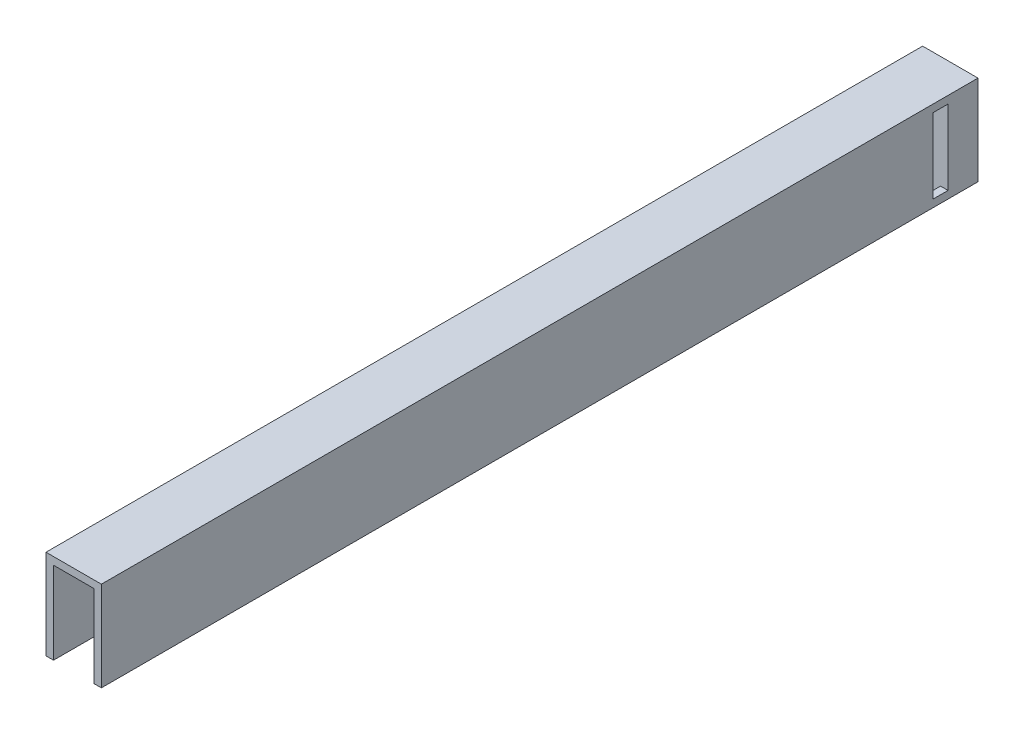
ISO-10303-21;
HEADER;
FILE_DESCRIPTION(('STEP AP214'),'2;1');
FILE_NAME('part.step','',(''),(''),'','','');
FILE_SCHEMA(('AUTOMOTIVE_DESIGN { 1 0 10303 214 1 1 1 1 }'));
ENDSEC;
DATA;
#1=APPLICATION_CONTEXT('core data for automotive mechanical design processes');
#2=APPLICATION_PROTOCOL_DEFINITION('international standard','automotive_design',2000,#1);
#3=PRODUCT_CONTEXT('',#1,'mechanical');
#4=PRODUCT('Part','Part','',(#3));
#5=PRODUCT_RELATED_PRODUCT_CATEGORY('part','',(#4));
#6=PRODUCT_DEFINITION_FORMATION('','',#4);
#7=PRODUCT_DEFINITION_CONTEXT('part definition',#1,'design');
#8=PRODUCT_DEFINITION('design','',#6,#7);
#9=PRODUCT_DEFINITION_SHAPE('','',#8);
#10=(LENGTH_UNIT() NAMED_UNIT(*) SI_UNIT(.MILLI.,.METRE.));
#11=(NAMED_UNIT(*) PLANE_ANGLE_UNIT() SI_UNIT($,.RADIAN.));
#12=(NAMED_UNIT(*) SI_UNIT($,.STERADIAN.) SOLID_ANGLE_UNIT());
#13=UNCERTAINTY_MEASURE_WITH_UNIT(LENGTH_MEASURE(1.E-05),#10,'distance_accuracy_value','');
#14=(GEOMETRIC_REPRESENTATION_CONTEXT(3) GLOBAL_UNCERTAINTY_ASSIGNED_CONTEXT((#13)) GLOBAL_UNIT_ASSIGNED_CONTEXT((#10,
#11,#12)) REPRESENTATION_CONTEXT('',''));
#15=CARTESIAN_POINT('',(0.,0.,0.));
#16=DIRECTION('',(0.,0.,1.));
#17=DIRECTION('',(1.,0.,0.));
#18=AXIS2_PLACEMENT_3D('',#15,#16,#17);
#19=CARTESIAN_POINT('',(-13.1469856686012,22.7753158980131,12.4635998388869));
#20=DIRECTION('',(-1.,0.,0.));
#21=DIRECTION('',(0.,0.,1.));
#22=AXIS2_PLACEMENT_3D('',#19,#20,#21);
#23=PLANE('',#22);
#24=DIRECTION('',(0.,0.,-1.));
#25=VECTOR('',#24,1.);
#26=CARTESIAN_POINT('',(-13.1469856686012,19.2220765281209,-147.432171806263));
#27=LINE('',#26,#25);
#28=CARTESIAN_POINT('',(-13.1469856686012,19.2220765281209,-143.878932436371));
#29=VERTEX_POINT('',#28);
#30=CARTESIAN_POINT('',(-13.1469856686012,19.2220765281209,-150.985411176155));
#31=VERTEX_POINT('',#30);
#32=EDGE_CURVE('E222',#29,#31,#27,.T.);
#33=ORIENTED_EDGE('',*,*,#32,.F.);
#34=DIRECTION('',(0.,-1.,0.));
#35=VECTOR('',#34,1.);
#36=CARTESIAN_POINT('',(-13.1469856686012,1.45587967865977,-143.878932436371));
#37=LINE('',#36,#35);
#38=CARTESIAN_POINT('',(-13.1469856686012,-16.3103171708013,-143.878932436371));
#39=VERTEX_POINT('',#38);
#40=EDGE_CURVE('E321',#29,#39,#37,.T.);
#41=ORIENTED_EDGE('',*,*,#40,.T.);
#42=DIRECTION('',(0.,0.,-1.));
#43=VECTOR('',#42,1.);
#44=CARTESIAN_POINT('',(-13.1469856686012,-16.3103171708013,-147.432171806263));
#45=LINE('',#44,#43);
#46=CARTESIAN_POINT('',(-13.1469856686012,-16.3103171708013,-150.985411176155));
#47=VERTEX_POINT('',#46);
#48=EDGE_CURVE('E224',#39,#47,#45,.T.);
#49=ORIENTED_EDGE('',*,*,#48,.T.);
#50=DIRECTION('',(0.,1.,0.));
#51=VECTOR('',#50,1.);
#52=CARTESIAN_POINT('',(-13.1469856686012,1.45587967865977,-150.985411176155));
#53=LINE('',#52,#51);
#54=EDGE_CURVE('E55',#47,#31,#53,.T.);
#55=ORIENTED_EDGE('',*,*,#54,.T.);
#56=EDGE_LOOP('',(#33,#41,#49,#55));
#57=FACE_BOUND('',#56,.T.);
#58=DIRECTION('',(0.,1.,0.));
#59=VECTOR('',#58,1.);
#60=CARTESIAN_POINT('',(-13.1469856686012,1.45587967865978,250.959868937549));
#61=LINE('',#60,#59);
#62=CARTESIAN_POINT('',(-13.1469856686012,-19.8635565406935,250.959868937549));
#63=VERTEX_POINT('',#62);
#64=CARTESIAN_POINT('',(-13.1469856686012,22.7753158980131,250.959868937549));
#65=VERTEX_POINT('',#64);
#66=EDGE_CURVE('E302',#63,#65,#61,.T.);
#67=ORIENTED_EDGE('',*,*,#66,.T.);
#68=DIRECTION('',(0.,0.,1.));
#69=VECTOR('',#68,1.);
#70=CARTESIAN_POINT('',(-13.1469856686012,22.7753158980131,42.8807501409123));
#71=LINE('',#70,#69);
#72=CARTESIAN_POINT('',(-13.1469856686012,22.7753158980131,-165.198368655724));
#73=VERTEX_POINT('',#72);
#74=EDGE_CURVE('E123',#73,#65,#71,.T.);
#75=ORIENTED_EDGE('',*,*,#74,.F.);
#76=DIRECTION('',(0.,1.,0.));
#77=VECTOR('',#76,1.);
#78=CARTESIAN_POINT('',(-13.1469856686012,1.45587967865978,-165.198368655724));
#79=LINE('',#78,#77);
#80=CARTESIAN_POINT('',(-13.1469856686012,-19.8635565406935,-165.198368655724));
#81=VERTEX_POINT('',#80);
#82=EDGE_CURVE('E336',#81,#73,#79,.T.);
#83=ORIENTED_EDGE('',*,*,#82,.F.);
#84=DIRECTION('',(0.,0.,1.));
#85=VECTOR('',#84,1.);
#86=CARTESIAN_POINT('',(-13.1469856686012,-19.8635565406935,42.8807501409123));
#87=LINE('',#86,#85);
#88=EDGE_CURVE('E107',#81,#63,#87,.T.);
#89=ORIENTED_EDGE('',*,*,#88,.T.);
#90=EDGE_LOOP('',(#67,#75,#83,#89));
#91=FACE_BOUND('',#90,.T.);
#92=ADVANCED_FACE('F44',(#57,#91),#23,.T.);
#93=CARTESIAN_POINT('',(13.1469856686012,-19.8635565406935,12.4635998388869));
#94=DIRECTION('',(1.,0.,0.));
#95=DIRECTION('',(0.,1.,0.));
#96=AXIS2_PLACEMENT_3D('',#93,#94,#95);
#97=PLANE('',#96);
#98=DIRECTION('',(0.,1.,0.));
#99=VECTOR('',#98,1.);
#100=CARTESIAN_POINT('',(13.1469856686012,1.45587967865977,-150.985411176155));
#101=LINE('',#100,#99);
#102=CARTESIAN_POINT('',(13.1469856686012,-16.3103171708013,-150.985411176155));
#103=VERTEX_POINT('',#102);
#104=CARTESIAN_POINT('',(13.1469856686012,19.2220765281209,-150.985411176155));
#105=VERTEX_POINT('',#104);
#106=EDGE_CURVE('E11',#103,#105,#101,.T.);
#107=ORIENTED_EDGE('',*,*,#106,.F.);
#108=DIRECTION('',(0.,0.,-1.));
#109=VECTOR('',#108,1.);
#110=CARTESIAN_POINT('',(13.1469856686012,-16.3103171708013,-147.432171806263));
#111=LINE('',#110,#109);
#112=CARTESIAN_POINT('',(13.1469856686012,-16.3103171708013,-143.878932436371));
#113=VERTEX_POINT('',#112);
#114=EDGE_CURVE('E291',#113,#103,#111,.T.);
#115=ORIENTED_EDGE('',*,*,#114,.F.);
#116=DIRECTION('',(0.,-1.,0.));
#117=VECTOR('',#116,1.);
#118=CARTESIAN_POINT('',(13.1469856686012,1.45587967865978,-143.878932436371));
#119=LINE('',#118,#117);
#120=CARTESIAN_POINT('',(13.1469856686012,19.2220765281209,-143.878932436371));
#121=VERTEX_POINT('',#120);
#122=EDGE_CURVE('E290',#121,#113,#119,.T.);
#123=ORIENTED_EDGE('',*,*,#122,.F.);
#124=DIRECTION('',(0.,0.,1.));
#125=VECTOR('',#124,1.);
#126=CARTESIAN_POINT('',(13.1469856686012,19.2220765281209,-147.432171806263));
#127=LINE('',#126,#125);
#128=EDGE_CURVE('E246',#105,#121,#127,.T.);
#129=ORIENTED_EDGE('',*,*,#128,.F.);
#130=EDGE_LOOP('',(#107,#115,#123,#129));
#131=FACE_BOUND('',#130,.T.);
#132=DIRECTION('',(0.,-1.,0.));
#133=VECTOR('',#132,1.);
#134=CARTESIAN_POINT('',(13.1469856686012,1.45587967865978,250.959868937549));
#135=LINE('',#134,#133);
#136=CARTESIAN_POINT('',(13.1469856686012,22.7753158980131,250.959868937549));
#137=VERTEX_POINT('',#136);
#138=CARTESIAN_POINT('',(13.1469856686012,-19.8635565406935,250.959868937549));
#139=VERTEX_POINT('',#138);
#140=EDGE_CURVE('E303',#137,#139,#135,.T.);
#141=ORIENTED_EDGE('',*,*,#140,.T.);
#142=DIRECTION('',(0.,0.,1.));
#143=VECTOR('',#142,1.);
#144=CARTESIAN_POINT('',(13.1469856686012,-19.8635565406935,42.8807501409123));
#145=LINE('',#144,#143);
#146=CARTESIAN_POINT('',(13.1469856686012,-19.8635565406935,-165.198368655724));
#147=VERTEX_POINT('',#146);
#148=EDGE_CURVE('E267',#147,#139,#145,.T.);
#149=ORIENTED_EDGE('',*,*,#148,.F.);
#150=DIRECTION('',(0.,-1.,0.));
#151=VECTOR('',#150,1.);
#152=CARTESIAN_POINT('',(13.1469856686012,1.45587967865978,-165.198368655724));
#153=LINE('',#152,#151);
#154=CARTESIAN_POINT('',(13.1469856686012,22.7753158980131,-165.198368655724));
#155=VERTEX_POINT('',#154);
#156=EDGE_CURVE('E281',#155,#147,#153,.T.);
#157=ORIENTED_EDGE('',*,*,#156,.F.);
#158=DIRECTION('',(0.,0.,1.));
#159=VECTOR('',#158,1.);
#160=CARTESIAN_POINT('',(13.1469856686012,22.7753158980131,42.8807501409123));
#161=LINE('',#160,#159);
#162=EDGE_CURVE('E193',#155,#137,#161,.T.);
#163=ORIENTED_EDGE('',*,*,#162,.T.);
#164=EDGE_LOOP('',(#141,#149,#157,#163));
#165=FACE_BOUND('',#164,.T.);
#166=ADVANCED_FACE('F629',(#131,#165),#97,.T.);
#167=CARTESIAN_POINT('',(13.1469856686012,-16.3103171708013,-150.985411176155));
#168=DIRECTION('',(0.,0.,1.));
#169=DIRECTION('',(1.,0.,0.));
#170=AXIS2_PLACEMENT_3D('',#167,#168,#169);
#171=PLANE('',#170);
#172=DIRECTION('',(-1.,0.,0.));
#173=VECTOR('',#172,1.);
#174=CARTESIAN_POINT('',(0.,19.2220765281209,-150.985411176155));
#175=LINE('',#174,#173);
#176=EDGE_CURVE('E235',#105,#31,#175,.T.);
#177=ORIENTED_EDGE('',*,*,#176,.T.);
#178=ORIENTED_EDGE('',*,*,#54,.F.);
#179=DIRECTION('',(-1.,0.,0.));
#180=VECTOR('',#179,1.);
#181=CARTESIAN_POINT('',(-11.3703659836551,-16.3103171708013,-150.985411176155));
#182=LINE('',#181,#180);
#183=CARTESIAN_POINT('',(-9.59374629870899,-16.3103171708013,-150.985411176155));
#184=VERTEX_POINT('',#183);
#185=EDGE_CURVE('E277',#184,#47,#182,.T.);
#186=ORIENTED_EDGE('',*,*,#185,.F.);
#187=DIRECTION('',(0.,1.,0.));
#188=VECTOR('',#187,1.);
#189=CARTESIAN_POINT('',(-9.59374629870899,-18.0869368557474,-150.985411176155));
#190=LINE('',#189,#188);
#191=CARTESIAN_POINT('',(-9.59374629870899,-19.8635565406935,-150.985411176155));
#192=VERTEX_POINT('',#191);
#193=EDGE_CURVE('E276',#192,#184,#190,.T.);
#194=ORIENTED_EDGE('',*,*,#193,.F.);
#195=DIRECTION('',(-1.,0.,0.));
#196=VECTOR('',#195,1.);
#197=CARTESIAN_POINT('',(0.,-19.8635565406935,-150.985411176155));
#198=LINE('',#197,#196);
#199=CARTESIAN_POINT('',(9.59374629870899,-19.8635565406935,-150.985411176155));
#200=VERTEX_POINT('',#199);
#201=EDGE_CURVE('E68',#200,#192,#198,.T.);
#202=ORIENTED_EDGE('',*,*,#201,.F.);
#203=DIRECTION('',(0.,1.,0.));
#204=VECTOR('',#203,1.);
#205=CARTESIAN_POINT('',(9.59374629870899,-18.0869368557474,-150.985411176155));
#206=LINE('',#205,#204);
#207=CARTESIAN_POINT('',(9.59374629870899,-16.3103171708013,-150.985411176155));
#208=VERTEX_POINT('',#207);
#209=EDGE_CURVE('E259',#200,#208,#206,.T.);
#210=ORIENTED_EDGE('',*,*,#209,.T.);
#211=DIRECTION('',(-1.,0.,0.));
#212=VECTOR('',#211,1.);
#213=CARTESIAN_POINT('',(11.3703659836551,-16.3103171708013,-150.985411176155));
#214=LINE('',#213,#212);
#215=EDGE_CURVE('E287',#103,#208,#214,.T.);
#216=ORIENTED_EDGE('',*,*,#215,.F.);
#217=ORIENTED_EDGE('',*,*,#106,.T.);
#218=EDGE_LOOP('',(#177,#178,#186,#194,#202,#210,#216,#217));
#219=FACE_BOUND('',#218,.T.);
#220=ADVANCED_FACE('F242',(#219),#171,.T.);
#221=CARTESIAN_POINT('',(-9.59374629870899,-19.8635565406935,12.4635998388869));
#222=DIRECTION('',(0.,1.,0.));
#223=DIRECTION('',(1.,0.,0.));
#224=AXIS2_PLACEMENT_3D('',#221,#222,#223);
#225=PLANE('',#224);
#226=DIRECTION('',(-1.,0.,0.));
#227=VECTOR('',#226,1.);
#228=CARTESIAN_POINT('',(-11.3703659836551,-19.8635565406935,250.959868937549));
#229=LINE('',#228,#227);
#230=CARTESIAN_POINT('',(-9.59374629870899,-19.8635565406935,250.959868937549));
#231=VERTEX_POINT('',#230);
#232=EDGE_CURVE('E347',#231,#63,#229,.T.);
#233=ORIENTED_EDGE('',*,*,#232,.T.);
#234=ORIENTED_EDGE('',*,*,#88,.F.);
#235=DIRECTION('',(-1.,0.,0.));
#236=VECTOR('',#235,1.);
#237=CARTESIAN_POINT('',(-11.3703659836551,-19.8635565406935,-165.198368655724));
#238=LINE('',#237,#236);
#239=CARTESIAN_POINT('',(-9.59374629870899,-19.8635565406935,-165.198368655724));
#240=VERTEX_POINT('',#239);
#241=EDGE_CURVE('E340',#240,#81,#238,.T.);
#242=ORIENTED_EDGE('',*,*,#241,.F.);
#243=DIRECTION('',(0.,0.,1.));
#244=VECTOR('',#243,1.);
#245=CARTESIAN_POINT('',(-9.59374629870899,-19.8635565406935,-159.157861726907));
#246=LINE('',#245,#244);
#247=CARTESIAN_POINT('',(-9.59374629870899,-19.8635565406935,-153.11735479809));
#248=VERTEX_POINT('',#247);
#249=EDGE_CURVE('E266',#240,#248,#246,.T.);
#250=ORIENTED_EDGE('',*,*,#249,.T.);
#251=DIRECTION('',(-1.,0.,0.));
#252=VECTOR('',#251,1.);
#253=CARTESIAN_POINT('',(0.,-19.8635565406935,-153.11735479809));
#254=LINE('',#253,#252);
#255=CARTESIAN_POINT('',(9.59374629870899,-19.8635565406935,-153.11735479809));
#256=VERTEX_POINT('',#255);
#257=EDGE_CURVE('E348',#256,#248,#254,.T.);
#258=ORIENTED_EDGE('',*,*,#257,.F.);
#259=DIRECTION('',(0.,0.,1.));
#260=VECTOR('',#259,1.);
#261=CARTESIAN_POINT('',(9.59374629870899,-19.8635565406935,-159.157861726907));
#262=LINE('',#261,#260);
#263=CARTESIAN_POINT('',(9.59374629870899,-19.8635565406935,-165.198368655724));
#264=VERTEX_POINT('',#263);
#265=EDGE_CURVE('E292',#264,#256,#262,.T.);
#266=ORIENTED_EDGE('',*,*,#265,.F.);
#267=DIRECTION('',(-1.,0.,0.));
#268=VECTOR('',#267,1.);
#269=CARTESIAN_POINT('',(11.3703659836551,-19.8635565406935,-165.198368655724));
#270=LINE('',#269,#268);
#271=EDGE_CURVE('E284',#147,#264,#270,.T.);
#272=ORIENTED_EDGE('',*,*,#271,.F.);
#273=ORIENTED_EDGE('',*,*,#148,.T.);
#274=DIRECTION('',(-1.,0.,0.));
#275=VECTOR('',#274,1.);
#276=CARTESIAN_POINT('',(11.3703659836551,-19.8635565406935,250.959868937549));
#277=LINE('',#276,#275);
#278=CARTESIAN_POINT('',(9.59374629870899,-19.8635565406935,250.959868937549));
#279=VERTEX_POINT('',#278);
#280=EDGE_CURVE('E48',#139,#279,#277,.T.);
#281=ORIENTED_EDGE('',*,*,#280,.T.);
#282=DIRECTION('',(0.,0.,1.));
#283=VECTOR('',#282,1.);
#284=CARTESIAN_POINT('',(9.59374629870899,-19.8635565406935,49.9872288806967));
#285=LINE('',#284,#283);
#286=EDGE_CURVE('E356',#200,#279,#285,.T.);
#287=ORIENTED_EDGE('',*,*,#286,.F.);
#288=ORIENTED_EDGE('',*,*,#201,.T.);
#289=DIRECTION('',(0.,0.,1.));
#290=VECTOR('',#289,1.);
#291=CARTESIAN_POINT('',(-9.59374629870899,-19.8635565406935,49.9872288806967));
#292=LINE('',#291,#290);
#293=EDGE_CURVE('E280',#192,#231,#292,.T.);
#294=ORIENTED_EDGE('',*,*,#293,.T.);
#295=EDGE_LOOP('',(#233,#234,#242,#250,#258,#266,#272,#273,#281,#287,#288,#294));
#296=FACE_BOUND('',#295,.T.);
#297=ADVANCED_FACE('F422',(#296),#225,.F.);
#298=CARTESIAN_POINT('',(-9.59374629870899,19.2220765281209,12.4635998388869));
#299=DIRECTION('',(-1.,0.,0.));
#300=DIRECTION('',(0.,0.,1.));
#301=AXIS2_PLACEMENT_3D('',#298,#299,#300);
#302=PLANE('',#301);
#303=ORIENTED_EDGE('',*,*,#193,.T.);
#304=DIRECTION('',(0.,0.,-1.));
#305=VECTOR('',#304,1.);
#306=CARTESIAN_POINT('',(-9.59374629870899,-16.3103171708013,-147.432171806263));
#307=LINE('',#306,#305);
#308=CARTESIAN_POINT('',(-9.59374629870899,-16.3103171708013,-143.878932436371));
#309=VERTEX_POINT('',#308);
#310=EDGE_CURVE('E298',#309,#184,#307,.T.);
#311=ORIENTED_EDGE('',*,*,#310,.F.);
#312=DIRECTION('',(0.,-1.,0.));
#313=VECTOR('',#312,1.);
#314=CARTESIAN_POINT('',(-9.59374629870899,1.45587967865977,-143.878932436371));
#315=LINE('',#314,#313);
#316=CARTESIAN_POINT('',(-9.59374629870899,19.2220765281209,-143.878932436371));
#317=VERTEX_POINT('',#316);
#318=EDGE_CURVE('E309',#317,#309,#315,.T.);
#319=ORIENTED_EDGE('',*,*,#318,.F.);
#320=DIRECTION('',(0.,0.,1.));
#321=VECTOR('',#320,1.);
#322=CARTESIAN_POINT('',(-9.59374629870899,19.2220765281209,53.540468250589));
#323=LINE('',#322,#321);
#324=CARTESIAN_POINT('',(-9.59374629870899,19.2220765281209,250.959868937549));
#325=VERTEX_POINT('',#324);
#326=EDGE_CURVE('E308',#317,#325,#323,.T.);
#327=ORIENTED_EDGE('',*,*,#326,.T.);
#328=DIRECTION('',(0.,-1.,0.));
#329=VECTOR('',#328,1.);
#330=CARTESIAN_POINT('',(-9.59374629870899,-0.320740006286334,250.959868937549));
#331=LINE('',#330,#329);
#332=EDGE_CURVE('E314',#325,#231,#331,.T.);
#333=ORIENTED_EDGE('',*,*,#332,.T.);
#334=ORIENTED_EDGE('',*,*,#293,.F.);
#335=EDGE_LOOP('',(#303,#311,#319,#327,#333,#334));
#336=FACE_BOUND('',#335,.T.);
#337=ADVANCED_FACE('F412',(#336),#302,.F.);
#338=CARTESIAN_POINT('',(13.1469856686012,-16.3103171708013,-143.878932436371));
#339=DIRECTION('',(0.,1.,0.));
#340=DIRECTION('',(1.,0.,0.));
#341=AXIS2_PLACEMENT_3D('',#338,#339,#340);
#342=PLANE('',#341);
#343=ORIENTED_EDGE('',*,*,#310,.T.);
#344=ORIENTED_EDGE('',*,*,#185,.T.);
#345=ORIENTED_EDGE('',*,*,#48,.F.);
#346=DIRECTION('',(-1.,0.,0.));
#347=VECTOR('',#346,1.);
#348=CARTESIAN_POINT('',(-11.3703659836551,-16.3103171708013,-143.878932436371));
#349=LINE('',#348,#347);
#350=EDGE_CURVE('E313',#309,#39,#349,.T.);
#351=ORIENTED_EDGE('',*,*,#350,.F.);
#352=EDGE_LOOP('',(#343,#344,#345,#351));
#353=FACE_BOUND('',#352,.T.);
#354=ADVANCED_FACE('F419',(#353),#342,.T.);
#355=CARTESIAN_POINT('',(-13.1469856686012,22.7753158980131,12.4635998388869));
#356=DIRECTION('',(0.,-1.,0.));
#357=DIRECTION('',(0.,0.,-1.));
#358=AXIS2_PLACEMENT_3D('',#355,#356,#357);
#359=PLANE('',#358);
#360=DIRECTION('',(1.,0.,0.));
#361=VECTOR('',#360,1.);
#362=CARTESIAN_POINT('',(0.,22.7753158980131,250.959868937549));
#363=LINE('',#362,#361);
#364=EDGE_CURVE('E299',#65,#137,#363,.T.);
#365=ORIENTED_EDGE('',*,*,#364,.T.);
#366=ORIENTED_EDGE('',*,*,#162,.F.);
#367=DIRECTION('',(1.,0.,0.));
#368=VECTOR('',#367,1.);
#369=CARTESIAN_POINT('',(0.,22.7753158980131,-165.198368655724));
#370=LINE('',#369,#368);
#371=EDGE_CURVE('E285',#73,#155,#370,.T.);
#372=ORIENTED_EDGE('',*,*,#371,.F.);
#373=ORIENTED_EDGE('',*,*,#74,.T.);
#374=EDGE_LOOP('',(#365,#366,#372,#373));
#375=FACE_BOUND('',#374,.T.);
#376=ADVANCED_FACE('F589',(#375),#359,.F.);
#377=CARTESIAN_POINT('',(9.59374629870899,-19.8635565406935,12.4635998388869));
#378=DIRECTION('',(1.,0.,0.));
#379=DIRECTION('',(0.,1.,0.));
#380=AXIS2_PLACEMENT_3D('',#377,#378,#379);
#381=PLANE('',#380);
#382=DIRECTION('',(0.,-1.,0.));
#383=VECTOR('',#382,1.);
#384=CARTESIAN_POINT('',(9.59374629870899,-0.320740006286334,-153.11735479809));
#385=LINE('',#384,#383);
#386=CARTESIAN_POINT('',(9.59374629870899,19.2220765281209,-153.11735479809));
#387=VERTEX_POINT('',#386);
#388=EDGE_CURVE('E352',#387,#256,#385,.T.);
#389=ORIENTED_EDGE('',*,*,#388,.F.);
#390=DIRECTION('',(0.,0.,1.));
#391=VECTOR('',#390,1.);
#392=CARTESIAN_POINT('',(9.59374629870899,19.2220765281209,-159.157861726907));
#393=LINE('',#392,#391);
#394=CARTESIAN_POINT('',(9.59374629870899,19.2220765281209,-165.198368655724));
#395=VERTEX_POINT('',#394);
#396=EDGE_CURVE('E327',#395,#387,#393,.T.);
#397=ORIENTED_EDGE('',*,*,#396,.F.);
#398=DIRECTION('',(0.,1.,0.));
#399=VECTOR('',#398,1.);
#400=CARTESIAN_POINT('',(9.59374629870899,-0.320740006286334,-165.198368655724));
#401=LINE('',#400,#399);
#402=EDGE_CURVE('E294',#264,#395,#401,.T.);
#403=ORIENTED_EDGE('',*,*,#402,.F.);
#404=ORIENTED_EDGE('',*,*,#265,.T.);
#405=EDGE_LOOP('',(#389,#397,#403,#404));
#406=FACE_BOUND('',#405,.T.);
#407=ADVANCED_FACE('F594',(#406),#381,.F.);
#408=CARTESIAN_POINT('',(0.,1.45587967865978,-165.198368655724));
#409=DIRECTION('',(0.,0.,1.));
#410=DIRECTION('',(1.,0.,0.));
#411=AXIS2_PLACEMENT_3D('',#408,#409,#410);
#412=PLANE('',#411);
#413=DIRECTION('',(0.,-1.,0.));
#414=VECTOR('',#413,1.);
#415=CARTESIAN_POINT('',(-9.59374629870899,-0.320740006286334,-165.198368655724));
#416=LINE('',#415,#414);
#417=CARTESIAN_POINT('',(-9.59374629870899,19.2220765281209,-165.198368655724));
#418=VERTEX_POINT('',#417);
#419=EDGE_CURVE('E261',#418,#240,#416,.T.);
#420=ORIENTED_EDGE('',*,*,#419,.T.);
#421=ORIENTED_EDGE('',*,*,#241,.T.);
#422=ORIENTED_EDGE('',*,*,#82,.T.);
#423=ORIENTED_EDGE('',*,*,#371,.T.);
#424=ORIENTED_EDGE('',*,*,#156,.T.);
#425=ORIENTED_EDGE('',*,*,#271,.T.);
#426=ORIENTED_EDGE('',*,*,#402,.T.);
#427=DIRECTION('',(-1.,0.,0.));
#428=VECTOR('',#427,1.);
#429=CARTESIAN_POINT('',(0.,19.2220765281209,-165.198368655724));
#430=LINE('',#429,#428);
#431=EDGE_CURVE('E324',#395,#418,#430,.T.);
#432=ORIENTED_EDGE('',*,*,#431,.T.);
#433=EDGE_LOOP('',(#420,#421,#422,#423,#424,#425,#426,#432));
#434=FACE_BOUND('',#433,.T.);
#435=ADVANCED_FACE('F559',(#434),#412,.F.);
#436=CARTESIAN_POINT('',(9.59374629870899,-19.8635565406935,-153.11735479809));
#437=DIRECTION('',(0.,0.,1.));
#438=DIRECTION('',(1.,0.,0.));
#439=AXIS2_PLACEMENT_3D('',#436,#437,#438);
#440=PLANE('',#439);
#441=DIRECTION('',(0.,1.,0.));
#442=VECTOR('',#441,1.);
#443=CARTESIAN_POINT('',(-9.59374629870899,-0.320740006286334,-153.11735479809));
#444=LINE('',#443,#442);
#445=CARTESIAN_POINT('',(-9.59374629870899,19.2220765281209,-153.11735479809));
#446=VERTEX_POINT('',#445);
#447=EDGE_CURVE('E317',#248,#446,#444,.T.);
#448=ORIENTED_EDGE('',*,*,#447,.T.);
#449=DIRECTION('',(-1.,0.,0.));
#450=VECTOR('',#449,1.);
#451=CARTESIAN_POINT('',(0.,19.2220765281209,-153.11735479809));
#452=LINE('',#451,#450);
#453=EDGE_CURVE('E353',#387,#446,#452,.T.);
#454=ORIENTED_EDGE('',*,*,#453,.F.);
#455=ORIENTED_EDGE('',*,*,#388,.T.);
#456=ORIENTED_EDGE('',*,*,#257,.T.);
#457=EDGE_LOOP('',(#448,#454,#455,#456));
#458=FACE_BOUND('',#457,.T.);
#459=ADVANCED_FACE('F553',(#458),#440,.F.);
#460=CARTESIAN_POINT('',(-9.59374629870899,19.2220765281209,12.4635998388869));
#461=DIRECTION('',(0.,-1.,0.));
#462=DIRECTION('',(0.,0.,-1.));
#463=AXIS2_PLACEMENT_3D('',#460,#461,#462);
#464=PLANE('',#463);
#465=DIRECTION('',(0.,0.,1.));
#466=VECTOR('',#465,1.);
#467=CARTESIAN_POINT('',(-9.59374629870899,19.2220765281209,-159.157861726907));
#468=LINE('',#467,#466);
#469=EDGE_CURVE('E265',#418,#446,#468,.T.);
#470=ORIENTED_EDGE('',*,*,#469,.F.);
#471=ORIENTED_EDGE('',*,*,#431,.F.);
#472=ORIENTED_EDGE('',*,*,#396,.T.);
#473=ORIENTED_EDGE('',*,*,#453,.T.);
#474=EDGE_LOOP('',(#470,#471,#472,#473));
#475=FACE_BOUND('',#474,.T.);
#476=ADVANCED_FACE('F558',(#475),#464,.T.);
#477=CARTESIAN_POINT('',(-9.59374629870899,19.2220765281209,12.4635998388869));
#478=DIRECTION('',(-1.,0.,0.));
#479=DIRECTION('',(0.,0.,1.));
#480=AXIS2_PLACEMENT_3D('',#477,#478,#479);
#481=PLANE('',#480);
#482=ORIENTED_EDGE('',*,*,#447,.F.);
#483=ORIENTED_EDGE('',*,*,#249,.F.);
#484=ORIENTED_EDGE('',*,*,#419,.F.);
#485=ORIENTED_EDGE('',*,*,#469,.T.);
#486=EDGE_LOOP('',(#482,#483,#484,#485));
#487=FACE_BOUND('',#486,.T.);
#488=ADVANCED_FACE('F606',(#487),#481,.F.);
#489=CARTESIAN_POINT('',(13.1469856686012,19.2220765281209,-143.878932436371));
#490=DIRECTION('',(0.,0.,-1.));
#491=DIRECTION('',(0.,-1.,0.));
#492=AXIS2_PLACEMENT_3D('',#489,#490,#491);
#493=PLANE('',#492);
#494=ORIENTED_EDGE('',*,*,#318,.T.);
#495=ORIENTED_EDGE('',*,*,#350,.T.);
#496=ORIENTED_EDGE('',*,*,#40,.F.);
#497=DIRECTION('',(-1.,0.,0.));
#498=VECTOR('',#497,1.);
#499=CARTESIAN_POINT('',(-11.3703659836551,19.2220765281209,-143.878932436371));
#500=LINE('',#499,#498);
#501=EDGE_CURVE('E238',#317,#29,#500,.T.);
#502=ORIENTED_EDGE('',*,*,#501,.F.);
#503=EDGE_LOOP('',(#494,#495,#496,#502));
#504=FACE_BOUND('',#503,.T.);
#505=ADVANCED_FACE('F416',(#504),#493,.T.);
#506=CARTESIAN_POINT('',(0.,1.45587967865978,250.959868937549));
#507=DIRECTION('',(0.,0.,1.));
#508=DIRECTION('',(1.,0.,0.));
#509=AXIS2_PLACEMENT_3D('',#506,#507,#508);
#510=PLANE('',#509);
#511=DIRECTION('',(-1.,0.,0.));
#512=VECTOR('',#511,1.);
#513=CARTESIAN_POINT('',(0.,19.2220765281209,250.959868937549));
#514=LINE('',#513,#512);
#515=CARTESIAN_POINT('',(9.59374629870899,19.2220765281209,250.959868937549));
#516=VERTEX_POINT('',#515);
#517=EDGE_CURVE('E304',#516,#325,#514,.T.);
#518=ORIENTED_EDGE('',*,*,#517,.F.);
#519=DIRECTION('',(0.,1.,0.));
#520=VECTOR('',#519,1.);
#521=CARTESIAN_POINT('',(9.59374629870899,-0.320740006286334,250.959868937549));
#522=LINE('',#521,#520);
#523=EDGE_CURVE('E360',#279,#516,#522,.T.);
#524=ORIENTED_EDGE('',*,*,#523,.F.);
#525=ORIENTED_EDGE('',*,*,#280,.F.);
#526=ORIENTED_EDGE('',*,*,#140,.F.);
#527=ORIENTED_EDGE('',*,*,#364,.F.);
#528=ORIENTED_EDGE('',*,*,#66,.F.);
#529=ORIENTED_EDGE('',*,*,#232,.F.);
#530=ORIENTED_EDGE('',*,*,#332,.F.);
#531=EDGE_LOOP('',(#518,#524,#525,#526,#527,#528,#529,#530));
#532=FACE_BOUND('',#531,.T.);
#533=ADVANCED_FACE('F407',(#532),#510,.T.);
#534=CARTESIAN_POINT('',(13.1469856686012,19.2220765281209,-143.878932436371));
#535=DIRECTION('',(0.,0.,-1.));
#536=DIRECTION('',(0.,-1.,0.));
#537=AXIS2_PLACEMENT_3D('',#534,#535,#536);
#538=PLANE('',#537);
#539=DIRECTION('',(-1.,0.,0.));
#540=VECTOR('',#539,1.);
#541=CARTESIAN_POINT('',(11.3703659836551,19.2220765281209,-143.878932436371));
#542=LINE('',#541,#540);
#543=CARTESIAN_POINT('',(9.59374629870899,19.2220765281209,-143.878932436371));
#544=VERTEX_POINT('',#543);
#545=EDGE_CURVE('E252',#121,#544,#542,.T.);
#546=ORIENTED_EDGE('',*,*,#545,.F.);
#547=ORIENTED_EDGE('',*,*,#122,.T.);
#548=DIRECTION('',(-1.,0.,0.));
#549=VECTOR('',#548,1.);
#550=CARTESIAN_POINT('',(11.3703659836551,-16.3103171708013,-143.878932436371));
#551=LINE('',#550,#549);
#552=CARTESIAN_POINT('',(9.59374629870899,-16.3103171708013,-143.878932436371));
#553=VERTEX_POINT('',#552);
#554=EDGE_CURVE('E240',#113,#553,#551,.T.);
#555=ORIENTED_EDGE('',*,*,#554,.T.);
#556=DIRECTION('',(0.,-1.,0.));
#557=VECTOR('',#556,1.);
#558=CARTESIAN_POINT('',(9.59374629870899,1.45587967865977,-143.878932436371));
#559=LINE('',#558,#557);
#560=EDGE_CURVE('E255',#544,#553,#559,.T.);
#561=ORIENTED_EDGE('',*,*,#560,.F.);
#562=EDGE_LOOP('',(#546,#547,#555,#561));
#563=FACE_BOUND('',#562,.T.);
#564=ADVANCED_FACE('F543',(#563),#538,.T.);
#565=CARTESIAN_POINT('',(13.1469856686012,-16.3103171708013,-143.878932436371));
#566=DIRECTION('',(0.,1.,0.));
#567=DIRECTION('',(1.,0.,0.));
#568=AXIS2_PLACEMENT_3D('',#565,#566,#567);
#569=PLANE('',#568);
#570=ORIENTED_EDGE('',*,*,#554,.F.);
#571=ORIENTED_EDGE('',*,*,#114,.T.);
#572=ORIENTED_EDGE('',*,*,#215,.T.);
#573=DIRECTION('',(0.,0.,-1.));
#574=VECTOR('',#573,1.);
#575=CARTESIAN_POINT('',(9.59374629870899,-16.3103171708013,-147.432171806263));
#576=LINE('',#575,#574);
#577=EDGE_CURVE('E247',#553,#208,#576,.T.);
#578=ORIENTED_EDGE('',*,*,#577,.F.);
#579=EDGE_LOOP('',(#570,#571,#572,#578));
#580=FACE_BOUND('',#579,.T.);
#581=ADVANCED_FACE('F537',(#580),#569,.T.);
#582=CARTESIAN_POINT('',(-9.59374629870899,19.2220765281209,12.4635998388869));
#583=DIRECTION('',(0.,-1.,0.));
#584=DIRECTION('',(0.,0.,-1.));
#585=AXIS2_PLACEMENT_3D('',#582,#583,#584);
#586=PLANE('',#585);
#587=ORIENTED_EDGE('',*,*,#176,.F.);
#588=ORIENTED_EDGE('',*,*,#128,.T.);
#589=ORIENTED_EDGE('',*,*,#545,.T.);
#590=DIRECTION('',(0.,0.,1.));
#591=VECTOR('',#590,1.);
#592=CARTESIAN_POINT('',(9.59374629870899,19.2220765281209,53.540468250589));
#593=LINE('',#592,#591);
#594=EDGE_CURVE('E273',#544,#516,#593,.T.);
#595=ORIENTED_EDGE('',*,*,#594,.T.);
#596=ORIENTED_EDGE('',*,*,#517,.T.);
#597=ORIENTED_EDGE('',*,*,#326,.F.);
#598=ORIENTED_EDGE('',*,*,#501,.T.);
#599=ORIENTED_EDGE('',*,*,#32,.T.);
#600=EDGE_LOOP('',(#587,#588,#589,#595,#596,#597,#598,#599));
#601=FACE_BOUND('',#600,.T.);
#602=ADVANCED_FACE('F233',(#601),#586,.T.);
#603=CARTESIAN_POINT('',(9.59374629870899,-19.8635565406935,12.4635998388869));
#604=DIRECTION('',(1.,0.,0.));
#605=DIRECTION('',(0.,1.,0.));
#606=AXIS2_PLACEMENT_3D('',#603,#604,#605);
#607=PLANE('',#606);
#608=ORIENTED_EDGE('',*,*,#209,.F.);
#609=ORIENTED_EDGE('',*,*,#286,.T.);
#610=ORIENTED_EDGE('',*,*,#523,.T.);
#611=ORIENTED_EDGE('',*,*,#594,.F.);
#612=ORIENTED_EDGE('',*,*,#560,.T.);
#613=ORIENTED_EDGE('',*,*,#577,.T.);
#614=EDGE_LOOP('',(#608,#609,#610,#611,#612,#613));
#615=FACE_BOUND('',#614,.T.);
#616=ADVANCED_FACE('F46',(#615),#607,.F.);
#617=CLOSED_SHELL('',(#92,#166,#220,#297,#337,#354,#376,#407,#435,#459,#476,#488,#505,#533,#564,
#581,#602,#616));
#618=MANIFOLD_SOLID_BREP('B2',#617);
#619=ADVANCED_BREP_SHAPE_REPRESENTATION('',(#18,#618),#14);
#620=SHAPE_DEFINITION_REPRESENTATION(#9,#619);
ENDSEC;
END-ISO-10303-21;
